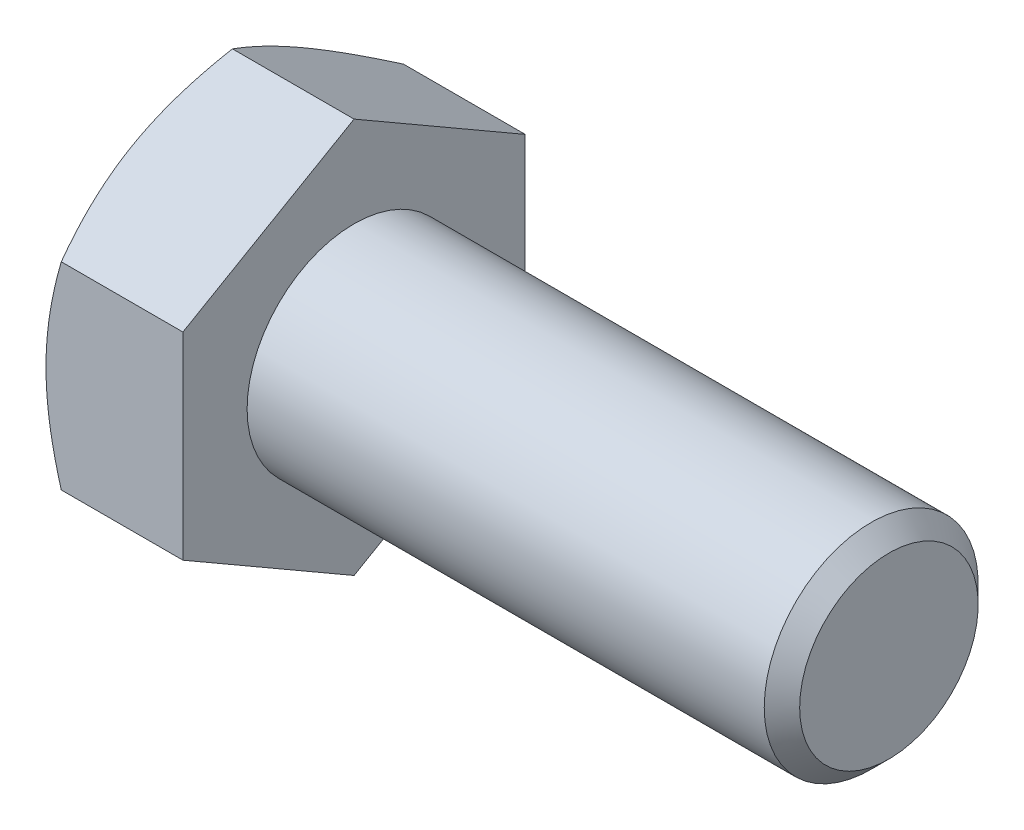
ISO-10303-21;
HEADER;
FILE_DESCRIPTION(('STEP AP214'),'2;1');
FILE_NAME('part.step','',(''),(''),'','','');
FILE_SCHEMA(('AUTOMOTIVE_DESIGN { 1 0 10303 214 1 1 1 1 }'));
ENDSEC;
DATA;
#1=APPLICATION_CONTEXT('core data for automotive mechanical design processes');
#2=APPLICATION_PROTOCOL_DEFINITION('international standard','automotive_design',2000,#1);
#3=PRODUCT_CONTEXT('',#1,'mechanical');
#4=PRODUCT('Part','Part','',(#3));
#5=PRODUCT_RELATED_PRODUCT_CATEGORY('part','',(#4));
#6=PRODUCT_DEFINITION_FORMATION('','',#4);
#7=PRODUCT_DEFINITION_CONTEXT('part definition',#1,'design');
#8=PRODUCT_DEFINITION('design','',#6,#7);
#9=PRODUCT_DEFINITION_SHAPE('','',#8);
#10=(LENGTH_UNIT() NAMED_UNIT(*) SI_UNIT(.MILLI.,.METRE.));
#11=(NAMED_UNIT(*) PLANE_ANGLE_UNIT() SI_UNIT($,.RADIAN.));
#12=(NAMED_UNIT(*) SI_UNIT($,.STERADIAN.) SOLID_ANGLE_UNIT());
#13=UNCERTAINTY_MEASURE_WITH_UNIT(LENGTH_MEASURE(1.E-05),#10,'distance_accuracy_value','');
#14=(GEOMETRIC_REPRESENTATION_CONTEXT(3) GLOBAL_UNCERTAINTY_ASSIGNED_CONTEXT((#13)) GLOBAL_UNIT_ASSIGNED_CONTEXT((#10,
#11,#12)) REPRESENTATION_CONTEXT('',''));
#15=CARTESIAN_POINT('',(0.,0.,0.));
#16=DIRECTION('',(0.,0.,1.));
#17=DIRECTION('',(1.,0.,0.));
#18=AXIS2_PLACEMENT_3D('',#15,#16,#17);
#19=CARTESIAN_POINT('',(6.4,4.618802153517,-8.));
#20=DIRECTION('',(0.,-0.866025403784438,0.500000000000001));
#21=DIRECTION('',(0.,-0.500000000000001,-0.866025403784438));
#22=AXIS2_PLACEMENT_3D('',#19,#20,#21);
#23=PLANE('',#22);
#24=CARTESIAN_POINT('',(0.714597847732979,9.23771977708786,0.0002));
#25=CARTESIAN_POINT('',(0.655990714047303,9.13619343437813,-0.175648783879896));
#26=CARTESIAN_POINT('',(0.600043401047296,9.03428856550538,-0.352153194306134));
#27=CARTESIAN_POINT('',(0.494201005024671,8.82965122633297,-0.706595462878459));
#28=CARTESIAN_POINT('',(0.444308534431071,8.72691841905233,-0.884533904692712));
#29=CARTESIAN_POINT('',(0.304692797206869,8.41707512197076,-1.42119823762264));
#30=CARTESIAN_POINT('',(0.225281170978371,8.20874154247285,-1.78204258223572));
#31=CARTESIAN_POINT('',(0.13216164629449,7.89697436704785,-2.32203917020405));
#32=CARTESIAN_POINT('',(0.105634581029126,7.79447216638295,-2.49957818964328));
#33=CARTESIAN_POINT('',(0.0611531748588764,7.58900421950647,-2.8554591129602));
#34=CARTESIAN_POINT('',(0.0431980765145801,7.4860385150631,-3.03380094449324));
#35=CARTESIAN_POINT('',(0.0163156484918647,7.27992981503517,-3.39079168482359));
#36=CARTESIAN_POINT('',(0.00737807354623315,7.17678715432034,-3.5694400136095));
#37=CARTESIAN_POINT('',(-0.00127769603487041,6.97040655051484,-3.92690170509738));
#38=CARTESIAN_POINT('',(-0.000996175497151026,6.86716861046638,-4.10571506253007));
#39=CARTESIAN_POINT('',(0.00814502526877449,6.67416139438126,-4.44001336701691));
#40=CARTESIAN_POINT('',(0.0158896043673687,6.58437849849726,-4.59552190433867));
#41=CARTESIAN_POINT('',(0.0382011348534268,6.40502298765178,-4.90617476174051));
#42=CARTESIAN_POINT('',(0.0527685461381453,6.31545038727451,-5.06131905656));
#43=CARTESIAN_POINT('',(0.106360690527533,6.04707935721953,-5.52615131589482));
#44=CARTESIAN_POINT('',(0.155268641669141,5.86875596743374,-5.83501648718172));
#45=CARTESIAN_POINT('',(0.277539403234311,5.51021755801477,-6.4560232287603));
#46=CARTESIAN_POINT('',(0.351420520375995,5.3300482973958,-6.76808554211448));
#47=CARTESIAN_POINT('',(0.519100141254967,4.97239658367397,-7.38755648169476));
#48=CARTESIAN_POINT('',(0.61285926085445,4.79490955046824,-7.69497304089175));
#49=CARTESIAN_POINT('',(0.714597847732972,4.61868668346316,-8.0002));
#50=B_SPLINE_CURVE_WITH_KNOTS('',3,(#24,#25,#26,#27,#28,#29,#30,#31,#32,#33,#34,#35,#36,#37,#38,
#39,#40,#41,#42,#43,#44,#45,#46,#47,#48,#49),.UNSPECIFIED.,.F.,.F.,(4,2,2,2,2,2,2,2,2,2,2,2,4),
(0.,0.633973543721351,1.26821965714356,2.53934712434766,3.15934343977049,3.77928496069784,
4.39852133866766,5.01773858515596,5.55680239410249,6.09590254421148,7.17487077411835,
8.27776850154293,9.37850115249055),.UNSPECIFIED.);
#51=CARTESIAN_POINT('',(0.714531179816327,9.23760430703402,0.));
#52=VERTEX_POINT('',#51);
#53=CARTESIAN_POINT('',(0.,6.9282032302755,-4.00000000000001));
#54=VERTEX_POINT('',#53);
#55=EDGE_CURVE('E51',#52,#54,#50,.T.);
#56=ORIENTED_EDGE('',*,*,#55,.F.);
#57=DIRECTION('',(-1.,0.,0.));
#58=VECTOR('',#57,1.);
#59=CARTESIAN_POINT('',(6.4,9.23760430703402,0.));
#60=LINE('',#59,#58);
#61=CARTESIAN_POINT('',(6.4,9.23760430703402,0.));
#62=VERTEX_POINT('',#61);
#63=EDGE_CURVE('E147',#62,#52,#60,.T.);
#64=ORIENTED_EDGE('',*,*,#63,.F.);
#65=DIRECTION('',(0.,0.500000000000001,0.866025403784438));
#66=VECTOR('',#65,1.);
#67=CARTESIAN_POINT('',(6.4,4.618802153517,-8.));
#68=LINE('',#67,#66);
#69=CARTESIAN_POINT('',(6.4,4.618802153517,-8.));
#70=VERTEX_POINT('',#69);
#71=EDGE_CURVE('E238',#70,#62,#68,.T.);
#72=ORIENTED_EDGE('',*,*,#71,.F.);
#73=DIRECTION('',(-1.,0.,0.));
#74=VECTOR('',#73,1.);
#75=CARTESIAN_POINT('',(6.4,4.618802153517,-8.));
#76=LINE('',#75,#74);
#77=CARTESIAN_POINT('',(0.71453117981632,4.618802153517,-8.));
#78=VERTEX_POINT('',#77);
#79=EDGE_CURVE('E135',#70,#78,#76,.T.);
#80=ORIENTED_EDGE('',*,*,#79,.T.);
#81=EDGE_CURVE('E129',#54,#78,#50,.T.);
#82=ORIENTED_EDGE('',*,*,#81,.F.);
#83=EDGE_LOOP('',(#56,#64,#72,#80,#82));
#84=FACE_BOUND('',#83,.T.);
#85=ADVANCED_FACE('F35',(#84),#23,.F.);
#86=CARTESIAN_POINT('',(6.4,9.23760430703402,0.));
#87=DIRECTION('',(0.,-0.866025403784438,-0.500000000000001));
#88=DIRECTION('',(0.,0.500000000000001,-0.866025403784438));
#89=AXIS2_PLACEMENT_3D('',#86,#87,#88);
#90=PLANE('',#89);
#91=CARTESIAN_POINT('',(0.714597847732973,4.61868668346316,8.0002));
#92=CARTESIAN_POINT('',(0.655990714047298,4.72021302617289,7.8243512161201));
#93=CARTESIAN_POINT('',(0.60004340104729,4.82211789504563,7.64784680569387));
#94=CARTESIAN_POINT('',(0.494201005024666,5.02675523421805,7.29340453712154));
#95=CARTESIAN_POINT('',(0.444308534431066,5.12948804149869,7.11546609530729));
#96=CARTESIAN_POINT('',(0.304692797206865,5.43933133858026,6.57880176237736));
#97=CARTESIAN_POINT('',(0.225281170978368,5.64766491807817,6.21795741776428));
#98=CARTESIAN_POINT('',(0.132161646294488,5.95943209350317,5.67796082979595));
#99=CARTESIAN_POINT('',(0.105634581029123,6.06193429416807,5.50042181035672));
#100=CARTESIAN_POINT('',(0.0611531748588752,6.26740224104454,5.1445408870398));
#101=CARTESIAN_POINT('',(0.0431980765145799,6.37036794548792,4.96619905550676));
#102=CARTESIAN_POINT('',(0.0163156484918649,6.57647664551585,4.60920831517641));
#103=CARTESIAN_POINT('',(0.00737807354623263,6.67961930623067,4.4305599863905));
#104=CARTESIAN_POINT('',(-0.00127769603487089,6.88599991003618,4.07309829490262));
#105=CARTESIAN_POINT('',(-0.000996175497150731,6.98923785008464,3.89428493746994));
#106=CARTESIAN_POINT('',(0.00814502526877543,7.18224506616975,3.5599866329831));
#107=CARTESIAN_POINT('',(0.0158896043673697,7.27202796205376,3.40447809566133));
#108=CARTESIAN_POINT('',(0.0382011348534283,7.45138347289924,3.09382523825949));
#109=CARTESIAN_POINT('',(0.0527685461381474,7.54095607327651,2.93868094344));
#110=CARTESIAN_POINT('',(0.106360690527536,7.80932710333149,2.47384868410519));
#111=CARTESIAN_POINT('',(0.155268641669144,7.98765049311728,2.16498351281828));
#112=CARTESIAN_POINT('',(0.277539403234314,8.34618890253625,1.5439767712397));
#113=CARTESIAN_POINT('',(0.351420520376,8.52635816315522,1.23191445788552));
#114=CARTESIAN_POINT('',(0.519100141254974,8.88400987687705,0.612443518305242));
#115=CARTESIAN_POINT('',(0.612859260854458,9.06149691008278,0.30502695910825));
#116=CARTESIAN_POINT('',(0.714597847732978,9.23771977708786,-0.000200000000000107));
#117=B_SPLINE_CURVE_WITH_KNOTS('',3,(#91,#92,#93,#94,#95,#96,#97,#98,#99,#100,#101,#102,#103,
#104,#105,#106,#107,#108,#109,#110,#111,#112,#113,#114,#115,#116),.UNSPECIFIED.,.F.,.F.,(4,2,2,
2,2,2,2,2,2,2,2,2,4),(0.,0.63397354372135,1.26821965714356,2.53934712434766,3.15934343977049,
3.77928496069784,4.39852133866766,5.01773858515595,5.55680239410249,6.09590254421148,
7.17487077411835,8.27776850154293,9.37850115249055),.UNSPECIFIED.);
#118=CARTESIAN_POINT('',(0.714531179816321,4.618802153517,8.));
#119=VERTEX_POINT('',#118);
#120=CARTESIAN_POINT('',(0.,6.9282032302755,4.00000000000001));
#121=VERTEX_POINT('',#120);
#122=EDGE_CURVE('E58',#119,#121,#117,.T.);
#123=ORIENTED_EDGE('',*,*,#122,.F.);
#124=DIRECTION('',(-1.,0.,0.));
#125=VECTOR('',#124,1.);
#126=CARTESIAN_POINT('',(6.4,4.618802153517,8.));
#127=LINE('',#126,#125);
#128=CARTESIAN_POINT('',(6.4,4.618802153517,8.));
#129=VERTEX_POINT('',#128);
#130=EDGE_CURVE('E145',#129,#119,#127,.T.);
#131=ORIENTED_EDGE('',*,*,#130,.F.);
#132=DIRECTION('',(0.,-0.500000000000001,0.866025403784438));
#133=VECTOR('',#132,1.);
#134=CARTESIAN_POINT('',(6.4,9.23760430703402,0.));
#135=LINE('',#134,#133);
#136=EDGE_CURVE('E236',#62,#129,#135,.T.);
#137=ORIENTED_EDGE('',*,*,#136,.F.);
#138=ORIENTED_EDGE('',*,*,#63,.T.);
#139=EDGE_CURVE('E162',#121,#52,#117,.T.);
#140=ORIENTED_EDGE('',*,*,#139,.F.);
#141=EDGE_LOOP('',(#123,#131,#137,#138,#140));
#142=FACE_BOUND('',#141,.T.);
#143=ADVANCED_FACE('F168',(#142),#90,.F.);
#144=CARTESIAN_POINT('',(6.4,4.618802153517,8.));
#145=DIRECTION('',(0.,0.,-1.));
#146=DIRECTION('',(0.,1.,0.));
#147=AXIS2_PLACEMENT_3D('',#144,#145,#146);
#148=PLANE('',#147);
#149=CARTESIAN_POINT('',(4.0249059095589,-12.6546855843617,8.));
#150=CARTESIAN_POINT('',(3.85338487375992,-12.3031246800229,8.));
#151=CARTESIAN_POINT('',(3.68343819387201,-11.9507829192251,8.));
#152=CARTESIAN_POINT('',(3.34757427772116,-11.2441233293434,8.));
#153=CARTESIAN_POINT('',(3.18165763115451,-10.8898052202859,8.));
#154=CARTESIAN_POINT('',(2.85395194343767,-10.1770689379398,8.));
#155=CARTESIAN_POINT('',(2.69218824963991,-9.81863907172209,8.));
#156=CARTESIAN_POINT('',(2.37495726740339,-9.09901412811098,8.));
#157=CARTESIAN_POINT('',(2.21948969724235,-8.7378191753042,8.));
#158=CARTESIAN_POINT('',(1.91124909611307,-7.99950051377994,8.));
#159=CARTESIAN_POINT('',(1.75875676572667,-7.6222589905811,8.));
#160=CARTESIAN_POINT('',(1.4647241129891,-6.86345576673941,8.));
#161=CARTESIAN_POINT('',(1.32318498461757,-6.48189360029687,8.));
#162=CARTESIAN_POINT('',(1.05459432501408,-5.71447512364443,8.));
#163=CARTESIAN_POINT('',(0.927515476081562,-5.32862847439953,8.));
#164=CARTESIAN_POINT('',(0.691757211097743,-4.55141880373956,8.));
#165=CARTESIAN_POINT('',(0.583072254842116,-4.16005748194272,8.));
#166=CARTESIAN_POINT('',(0.389750376844221,-3.37376378274518,8.));
#167=CARTESIAN_POINT('',(0.304973724086277,-2.97886668674348,8.));
#168=CARTESIAN_POINT('',(0.199275200237229,-2.38273452840881,8.));
#169=CARTESIAN_POINT('',(0.16761875570946,-2.18337977711938,8.));
#170=CARTESIAN_POINT('',(0.112075358694773,-1.78359737601684,8.));
#171=CARTESIAN_POINT('',(0.0881876500546175,-1.58316983255303,8.));
#172=CARTESIAN_POINT('',(0.0489706977401173,-1.18423542027824,8.));
#173=CARTESIAN_POINT('',(0.0335291730980846,-0.985739637458753,8.));
#174=CARTESIAN_POINT('',(0.0110629716488628,-0.588272086946668,8.));
#175=CARTESIAN_POINT('',(0.00403814825767006,-0.389300327604079,8.));
#176=CARTESIAN_POINT('',(-0.00142584062082072,0.00876221081485041,8.));
#177=CARTESIAN_POINT('',(0.000134957676475766,0.207852989385609,8.));
#178=CARTESIAN_POINT('',(0.0118014217876197,0.605786203078692,8.));
#179=CARTESIAN_POINT('',(0.021907467381071,0.804628626769928,8.));
#180=CARTESIAN_POINT('',(0.0557165373437156,1.27520491378394,8.));
#181=CARTESIAN_POINT('',(0.0830672695242088,1.54668291471765,8.));
#182=CARTESIAN_POINT('',(0.152259238389072,2.08777092307493,8.));
#183=CARTESIAN_POINT('',(0.194102243863657,2.35738069838157,8.));
#184=CARTESIAN_POINT('',(0.339163188799742,3.1630177466564,8.));
#185=CARTESIAN_POINT('',(0.461891294668976,3.69558688173418,8.));
#186=CARTESIAN_POINT('',(0.676586595213059,4.49226053267631,8.));
#187=CARTESIAN_POINT('',(0.754301850106128,4.76044512009594,8.));
#188=CARTESIAN_POINT('',(0.918275616254534,5.29421544036087,8.));
#189=CARTESIAN_POINT('',(1.00453419017724,5.55980115412707,8.));
#190=CARTESIAN_POINT('',(1.18417203245489,6.0884483689393,8.));
#191=CARTESIAN_POINT('',(1.27754931556252,6.35151055086866,8.));
#192=CARTESIAN_POINT('',(1.47027924561323,6.87542420819582,8.));
#193=CARTESIAN_POINT('',(1.56963178297477,7.1362757240355,8.));
#194=CARTESIAN_POINT('',(1.83061788216801,7.80218874880575,8.));
#195=CARTESIAN_POINT('',(1.99585030591404,8.20583800152902,8.));
#196=CARTESIAN_POINT('',(2.33560643435574,9.00922090340246,8.));
#197=CARTESIAN_POINT('',(2.5101309931742,9.40895418858892,8.));
#198=CARTESIAN_POINT('',(2.86641484762338,10.2053302393418,8.));
#199=CARTESIAN_POINT('',(3.04817649203489,10.6019719507727,8.));
#200=CARTESIAN_POINT('',(3.41731474780413,11.3926098653434,8.));
#201=CARTESIAN_POINT('',(3.60469117417197,11.7866061551194,8.));
#202=CARTESIAN_POINT('',(3.98417976786821,12.5730081264133,8.));
#203=CARTESIAN_POINT('',(4.17629837893025,12.9654106921397,8.));
#204=CARTESIAN_POINT('',(4.56413460673707,13.7484335593548,8.));
#205=CARTESIAN_POINT('',(4.75985224746019,14.1390538489476,8.));
#206=CARTESIAN_POINT('',(5.15417790496087,14.9187386930099,8.));
#207=CARTESIAN_POINT('',(5.3527853705295,15.3078035265797,8.));
#208=CARTESIAN_POINT('',(5.75241277357115,16.0846929446672,8.));
#209=CARTESIAN_POINT('',(5.95343272118931,16.4725175239607,8.));
#210=CARTESIAN_POINT('',(6.52023157707932,17.5591699504467,8.));
#211=CARTESIAN_POINT('',(6.88826669162659,18.2568207923884,8.));
#212=CARTESIAN_POINT('',(7.62911645716787,19.6496204420456,8.));
#213=CARTESIAN_POINT('',(8.00193135552977,20.3447691178627,8.));
#214=CARTESIAN_POINT('',(8.74998840178781,21.7309493426279,8.));
#215=CARTESIAN_POINT('',(9.12521929790289,22.4219869677796,8.));
#216=CARTESIAN_POINT('',(9.69012625678304,23.4573861735835,8.));
#217=CARTESIAN_POINT('',(9.87876537279047,23.8023143161837,8.));
#218=CARTESIAN_POINT('',(10.2566598278908,24.4918321964471,8.));
#219=CARTESIAN_POINT('',(10.4459151660088,24.8364219346447,8.));
#220=CARTESIAN_POINT('',(10.635441440782,25.1808626322182,8.));
#221=B_SPLINE_CURVE_WITH_KNOTS('',3,(#149,#150,#151,#152,#153,#154,#155,#156,#157,#158,#159,
#160,#161,#162,#163,#164,#165,#166,#167,#168,#169,#170,#171,#172,#173,#174,#175,#176,#177,#178,
#179,#180,#181,#182,#183,#184,#185,#186,#187,#188,#189,#190,#191,#192,#193,#194,#195,#196,#197,
#198,#199,#200,#201,#202,#203,#204,#205,#206,#207,#208,#209,#210,#211,#212,#213,#214,#215,#216,
#217,#218,#219,#220),.UNSPECIFIED.,.F.,.F.,(4,2,2,2,2,2,2,2,2,2,2,2,2,2,2,2,2,2,2,2,2,2,2,2,2,2,
2,2,2,2,2,2,2,2,2,4),(0.,1.17352534285519,2.34722138025917,3.52689945010166,4.70652467637677,
5.92708317141315,7.14777452944079,8.36612012171132,9.58409809506408,10.7948027119676,
11.4002329189197,12.0056041799731,12.6027191107726,13.199823642157,13.7969256548693,
14.3940542062034,15.2121538291978,16.030353336924,17.6675489652002,18.5051258655031,
19.3427089100958,20.1800592201861,21.0173941785985,22.3257038346385,23.6341339573728,
24.9429922461244,26.2518074593073,27.5625113626671,28.8732240016858,30.1836898283921,
31.4941611678941,33.8604585893124,36.2268789719356,38.5858914350282,39.7653150976311,
40.9447368953005),.UNSPECIFIED.);
#222=CARTESIAN_POINT('',(0.714531179816316,-4.61880215351698,8.));
#223=VERTEX_POINT('',#222);
#224=CARTESIAN_POINT('',(0.,0.,8.));
#225=VERTEX_POINT('',#224);
#226=EDGE_CURVE('E248',#223,#225,#221,.T.);
#227=ORIENTED_EDGE('',*,*,#226,.F.);
#228=DIRECTION('',(-1.,0.,0.));
#229=VECTOR('',#228,1.);
#230=CARTESIAN_POINT('',(6.4,-4.61880215351698,8.));
#231=LINE('',#230,#229);
#232=CARTESIAN_POINT('',(6.4,-4.61880215351698,8.));
#233=VERTEX_POINT('',#232);
#234=EDGE_CURVE('E137',#233,#223,#231,.T.);
#235=ORIENTED_EDGE('',*,*,#234,.F.);
#236=DIRECTION('',(0.,-1.,0.));
#237=VECTOR('',#236,1.);
#238=CARTESIAN_POINT('',(6.4,4.618802153517,8.));
#239=LINE('',#238,#237);
#240=EDGE_CURVE('E232',#129,#233,#239,.T.);
#241=ORIENTED_EDGE('',*,*,#240,.F.);
#242=ORIENTED_EDGE('',*,*,#130,.T.);
#243=EDGE_CURVE('E186',#225,#119,#221,.T.);
#244=ORIENTED_EDGE('',*,*,#243,.F.);
#245=EDGE_LOOP('',(#227,#235,#241,#242,#244));
#246=FACE_BOUND('',#245,.T.);
#247=ADVANCED_FACE('F254',(#246),#148,.F.);
#248=CARTESIAN_POINT('',(6.4,-9.23760430703401,0.));
#249=DIRECTION('',(0.,0.866025403784437,-0.500000000000002));
#250=DIRECTION('',(0.,0.500000000000002,0.866025403784438));
#251=AXIS2_PLACEMENT_3D('',#248,#249,#250);
#252=PLANE('',#251);
#253=CARTESIAN_POINT('',(0.714597847732975,-9.23771977708785,-0.000200000000000038));
#254=CARTESIAN_POINT('',(0.655990714047299,-9.13619343437813,0.175648783879895));
#255=CARTESIAN_POINT('',(0.60004340104729,-9.03428856550538,0.352153194306134));
#256=CARTESIAN_POINT('',(0.494201005024666,-8.82965122633296,0.706595462878459));
#257=CARTESIAN_POINT('',(0.444308534431066,-8.72691841905232,0.884533904692711));
#258=CARTESIAN_POINT('',(0.304692797206864,-8.41707512197076,1.42119823762264));
#259=CARTESIAN_POINT('',(0.225281170978367,-8.20874154247284,1.78204258223572));
#260=CARTESIAN_POINT('',(0.132161646294485,-7.89697436704784,2.32203917020405));
#261=CARTESIAN_POINT('',(0.10563458102912,-7.79447216638294,2.49957818964328));
#262=CARTESIAN_POINT('',(0.0611531748588715,-7.58900421950646,2.8554591129602));
#263=CARTESIAN_POINT('',(0.043198076514576,-7.48603851506309,3.03380094449324));
#264=CARTESIAN_POINT('',(0.0163156484918609,-7.27992981503516,3.39079168482359));
#265=CARTESIAN_POINT('',(0.00737807354622867,-7.17678715432034,3.5694400136095));
#266=CARTESIAN_POINT('',(-0.00127769603487594,-6.97040655051483,3.92690170509738));
#267=CARTESIAN_POINT('',(-0.000996175497156998,-6.86716861046637,4.10571506253006));
#268=CARTESIAN_POINT('',(0.00814502526876799,-6.67416139438126,4.4400133670169));
#269=CARTESIAN_POINT('',(0.0158896043673621,-6.58437849849725,4.59552190433867));
#270=CARTESIAN_POINT('',(0.0382011348534206,-6.40502298765177,4.90617476174051));
#271=CARTESIAN_POINT('',(0.0527685461381397,-6.3154503872745,5.06131905655999));
#272=CARTESIAN_POINT('',(0.106360690527528,-6.04707935721952,5.52615131589481));
#273=CARTESIAN_POINT('',(0.155268641669135,-5.86875596743373,5.83501648718172));
#274=CARTESIAN_POINT('',(0.277539403234304,-5.51021755801476,6.4560232287603));
#275=CARTESIAN_POINT('',(0.351420520375989,-5.33004829739579,6.76808554211447));
#276=CARTESIAN_POINT('',(0.519100141254961,-4.97239658367396,7.38755648169476));
#277=CARTESIAN_POINT('',(0.612859260854445,-4.79490955046823,7.69497304089175));
#278=CARTESIAN_POINT('',(0.714597847732967,-4.61868668346315,8.0002));
#279=B_SPLINE_CURVE_WITH_KNOTS('',3,(#253,#254,#255,#256,#257,#258,#259,#260,#261,#262,#263,
#264,#265,#266,#267,#268,#269,#270,#271,#272,#273,#274,#275,#276,#277,#278),.UNSPECIFIED.,.F.,
.F.,(4,2,2,2,2,2,2,2,2,2,2,2,4),(0.,0.633973543721351,1.26821965714356,2.53934712434766,
3.15934343977049,3.77928496069784,4.39852133866766,5.01773858515595,5.55680239410249,
6.09590254421148,7.17487077411835,8.27776850154293,9.37850115249056),.UNSPECIFIED.);
#280=CARTESIAN_POINT('',(0.714531179816323,-9.23760430703401,0.));
#281=VERTEX_POINT('',#280);
#282=CARTESIAN_POINT('',(0.,-6.9282032302755,4.00000000000002));
#283=VERTEX_POINT('',#282);
#284=EDGE_CURVE('E170',#281,#283,#279,.T.);
#285=ORIENTED_EDGE('',*,*,#284,.F.);
#286=DIRECTION('',(-1.,0.,0.));
#287=VECTOR('',#286,1.);
#288=CARTESIAN_POINT('',(6.4,-9.23760430703401,0.));
#289=LINE('',#288,#287);
#290=CARTESIAN_POINT('',(6.4,-9.23760430703401,0.));
#291=VERTEX_POINT('',#290);
#292=EDGE_CURVE('E134',#291,#281,#289,.T.);
#293=ORIENTED_EDGE('',*,*,#292,.F.);
#294=DIRECTION('',(0.,-0.500000000000002,-0.866025403784438));
#295=VECTOR('',#294,1.);
#296=CARTESIAN_POINT('',(6.4,-9.23760430703401,0.));
#297=LINE('',#296,#295);
#298=EDGE_CURVE('E230',#233,#291,#297,.T.);
#299=ORIENTED_EDGE('',*,*,#298,.F.);
#300=ORIENTED_EDGE('',*,*,#234,.T.);
#301=EDGE_CURVE('E172',#283,#223,#279,.T.);
#302=ORIENTED_EDGE('',*,*,#301,.F.);
#303=EDGE_LOOP('',(#285,#293,#299,#300,#302));
#304=FACE_BOUND('',#303,.T.);
#305=ADVANCED_FACE('F226',(#304),#252,.F.);
#306=CARTESIAN_POINT('',(6.4,-4.61880215351701,-8.));
#307=DIRECTION('',(0.,0.866025403784439,0.5));
#308=DIRECTION('',(0.,-0.5,0.866025403784439));
#309=AXIS2_PLACEMENT_3D('',#306,#307,#308);
#310=PLANE('',#309);
#311=CARTESIAN_POINT('',(0.714597847732976,-4.61868668346317,-8.0002));
#312=CARTESIAN_POINT('',(0.655990714047301,-4.7202130261729,-7.8243512161201));
#313=CARTESIAN_POINT('',(0.600043401047293,-4.82211789504565,-7.64784680569387));
#314=CARTESIAN_POINT('',(0.494201005024669,-5.02675523421806,-7.29340453712154));
#315=CARTESIAN_POINT('',(0.444308534431069,-5.1294880414987,-7.11546609530729));
#316=CARTESIAN_POINT('',(0.304692797206868,-5.43933133858027,-6.57880176237736));
#317=CARTESIAN_POINT('',(0.225281170978371,-5.64766491807818,-6.21795741776427));
#318=CARTESIAN_POINT('',(0.13216164629449,-5.95943209350317,-5.67796082979595));
#319=CARTESIAN_POINT('',(0.105634581029126,-6.06193429416808,-5.50042181035671));
#320=CARTESIAN_POINT('',(0.0611531748588766,-6.26740224104455,-5.1445408870398));
#321=CARTESIAN_POINT('',(0.0431980765145806,-6.37036794548792,-4.96619905550676));
#322=CARTESIAN_POINT('',(0.0163156484918658,-6.57647664551586,-4.6092083151764));
#323=CARTESIAN_POINT('',(0.00737807354623422,-6.67961930623068,-4.4305599863905));
#324=CARTESIAN_POINT('',(-0.00127769603486898,-6.88599991003619,-4.07309829490261));
#325=CARTESIAN_POINT('',(-0.000996175497149287,-6.98923785008464,-3.89428493746993));
#326=CARTESIAN_POINT('',(0.00814502526877674,-7.18224506616976,-3.55998663298309));
#327=CARTESIAN_POINT('',(0.0158896043673712,-7.27202796205376,-3.40447809566132));
#328=CARTESIAN_POINT('',(0.0382011348534295,-7.45138347289924,-3.09382523825949));
#329=CARTESIAN_POINT('',(0.052768546138148,-7.54095607327651,-2.93868094344));
#330=CARTESIAN_POINT('',(0.106360690527535,-7.80932710333149,-2.47384868410518));
#331=CARTESIAN_POINT('',(0.155268641669143,-7.98765049311728,-2.16498351281828));
#332=CARTESIAN_POINT('',(0.277539403234313,-8.34618890253624,-1.5439767712397));
#333=CARTESIAN_POINT('',(0.351420520375999,-8.52635816315522,-1.23191445788552));
#334=CARTESIAN_POINT('',(0.519100141254971,-8.88400987687704,-0.612443518305241));
#335=CARTESIAN_POINT('',(0.612859260854454,-9.06149691008277,-0.30502695910825));
#336=CARTESIAN_POINT('',(0.714597847732974,-9.23771977708785,0.000200000000000447));
#337=B_SPLINE_CURVE_WITH_KNOTS('',3,(#311,#312,#313,#314,#315,#316,#317,#318,#319,#320,#321,
#322,#323,#324,#325,#326,#327,#328,#329,#330,#331,#332,#333,#334,#335,#336),.UNSPECIFIED.,.F.,
.F.,(4,2,2,2,2,2,2,2,2,2,2,2,4),(0.,0.633973543721351,1.26821965714356,2.53934712434766,
3.15934343977049,3.77928496069784,4.39852133866766,5.01773858515595,5.55680239410249,
6.09590254421148,7.17487077411835,8.27776850154292,9.37850115249054),.UNSPECIFIED.);
#338=CARTESIAN_POINT('',(0.71453117981616,-4.61880215351726,-8.));
#339=VERTEX_POINT('',#338);
#340=CARTESIAN_POINT('',(0.,-6.92820323027551,-4.));
#341=VERTEX_POINT('',#340);
#342=EDGE_CURVE('E111',#339,#341,#337,.T.);
#343=ORIENTED_EDGE('',*,*,#342,.F.);
#344=DIRECTION('',(-1.,0.,0.));
#345=VECTOR('',#344,1.);
#346=CARTESIAN_POINT('',(6.4,-4.61880215351701,-8.));
#347=LINE('',#346,#345);
#348=CARTESIAN_POINT('',(6.4,-4.61880215351701,-8.));
#349=VERTEX_POINT('',#348);
#350=EDGE_CURVE('E125',#349,#339,#347,.T.);
#351=ORIENTED_EDGE('',*,*,#350,.F.);
#352=DIRECTION('',(0.,0.5,-0.866025403784439));
#353=VECTOR('',#352,1.);
#354=CARTESIAN_POINT('',(6.4,-4.61880215351701,-8.));
#355=LINE('',#354,#353);
#356=EDGE_CURVE('E228',#291,#349,#355,.T.);
#357=ORIENTED_EDGE('',*,*,#356,.F.);
#358=ORIENTED_EDGE('',*,*,#292,.T.);
#359=EDGE_CURVE('E128',#341,#281,#337,.T.);
#360=ORIENTED_EDGE('',*,*,#359,.F.);
#361=EDGE_LOOP('',(#343,#351,#357,#358,#360));
#362=FACE_BOUND('',#361,.T.);
#363=ADVANCED_FACE('F123',(#362),#310,.F.);
#364=CARTESIAN_POINT('',(6.4,4.618802153517,-8.));
#365=DIRECTION('',(0.,0.,1.));
#366=DIRECTION('',(1.,0.,0.));
#367=AXIS2_PLACEMENT_3D('',#364,#365,#366);
#368=PLANE('',#367);
#369=CARTESIAN_POINT('',(4.02490590955892,-12.6546855843617,-8.));
#370=CARTESIAN_POINT('',(3.85338487375994,-12.3031246800229,-8.));
#371=CARTESIAN_POINT('',(3.68343819387203,-11.9507829192251,-8.));
#372=CARTESIAN_POINT('',(3.34757427772117,-11.2441233293434,-8.));
#373=CARTESIAN_POINT('',(3.18165763115452,-10.889805220286,-8.));
#374=CARTESIAN_POINT('',(2.85395194343769,-10.1770689379399,-8.));
#375=CARTESIAN_POINT('',(2.69218824963993,-9.81863907172212,-8.));
#376=CARTESIAN_POINT('',(2.37495726740341,-9.09901412811101,-8.));
#377=CARTESIAN_POINT('',(2.21948969724236,-8.73781917530424,-8.));
#378=CARTESIAN_POINT('',(1.91124909611308,-7.99950051377997,-8.));
#379=CARTESIAN_POINT('',(1.75875676572668,-7.62225899058113,-8.));
#380=CARTESIAN_POINT('',(1.46472411298911,-6.86345576673944,-8.));
#381=CARTESIAN_POINT('',(1.32318498461758,-6.4818936002969,-8.));
#382=CARTESIAN_POINT('',(1.05459432501409,-5.71447512364446,-8.));
#383=CARTESIAN_POINT('',(0.927515476081571,-5.32862847439956,-8.));
#384=CARTESIAN_POINT('',(0.691757211097752,-4.55141880373959,-8.));
#385=CARTESIAN_POINT('',(0.583072254842124,-4.16005748194275,-8.));
#386=CARTESIAN_POINT('',(0.389750376844226,-3.37376378274521,-8.));
#387=CARTESIAN_POINT('',(0.304973724086282,-2.9788666867435,-8.));
#388=CARTESIAN_POINT('',(0.199275200237234,-2.38273452840883,-8.));
#389=CARTESIAN_POINT('',(0.167618755709465,-2.1833797771194,-8.));
#390=CARTESIAN_POINT('',(0.112075358694778,-1.78359737601686,-8.));
#391=CARTESIAN_POINT('',(0.0881876500546208,-1.58316983255305,-8.));
#392=CARTESIAN_POINT('',(0.0489706977401193,-1.18423542027826,-8.));
#393=CARTESIAN_POINT('',(0.0335291730980864,-0.985739637458773,-8.));
#394=CARTESIAN_POINT('',(0.0110629716488642,-0.588272086946688,-8.));
#395=CARTESIAN_POINT('',(0.00403814825767108,-0.389300327604099,-8.));
#396=CARTESIAN_POINT('',(-0.0014258406208207,0.00876221081483027,-8.));
#397=CARTESIAN_POINT('',(0.000134957676475132,0.207852989385589,-8.));
#398=CARTESIAN_POINT('',(0.0118014217876193,0.605786203078673,-8.));
#399=CARTESIAN_POINT('',(0.0219074673810715,0.804628626769909,-8.));
#400=CARTESIAN_POINT('',(0.0557165373437159,1.27520491378392,-8.));
#401=CARTESIAN_POINT('',(0.0830672695242071,1.54668291471763,-8.));
#402=CARTESIAN_POINT('',(0.152259238389069,2.08777092307492,-8.));
#403=CARTESIAN_POINT('',(0.194102243863653,2.35738069838155,-8.));
#404=CARTESIAN_POINT('',(0.339163188799738,3.16301774665637,-8.));
#405=CARTESIAN_POINT('',(0.461891294668971,3.69558688173416,-8.));
#406=CARTESIAN_POINT('',(0.676586595213053,4.49226053267629,-8.));
#407=CARTESIAN_POINT('',(0.754301850106122,4.76044512009592,-8.));
#408=CARTESIAN_POINT('',(0.918275616254527,5.29421544036084,-8.));
#409=CARTESIAN_POINT('',(1.00453419017723,5.55980115412704,-8.));
#410=CARTESIAN_POINT('',(1.18417203245488,6.08844836893928,-8.));
#411=CARTESIAN_POINT('',(1.27754931556251,6.35151055086863,-8.));
#412=CARTESIAN_POINT('',(1.47027924561321,6.87542420819579,-8.));
#413=CARTESIAN_POINT('',(1.56963178297475,7.13627572403547,-8.));
#414=CARTESIAN_POINT('',(1.830617882168,7.80218874880572,-8.));
#415=CARTESIAN_POINT('',(1.99585030591402,8.20583800152899,-8.));
#416=CARTESIAN_POINT('',(2.33560643435573,9.00922090340243,-8.));
#417=CARTESIAN_POINT('',(2.51013099317419,9.40895418858889,-8.));
#418=CARTESIAN_POINT('',(2.86641484762337,10.2053302393418,-8.));
#419=CARTESIAN_POINT('',(3.04817649203488,10.6019719507727,-8.));
#420=CARTESIAN_POINT('',(3.41731474780412,11.3926098653434,-8.));
#421=CARTESIAN_POINT('',(3.60469117417196,11.7866061551194,-8.));
#422=CARTESIAN_POINT('',(3.9841797678682,12.5730081264133,-8.));
#423=CARTESIAN_POINT('',(4.17629837893024,12.9654106921397,-8.));
#424=CARTESIAN_POINT('',(4.56413460673706,13.7484335593548,-8.));
#425=CARTESIAN_POINT('',(4.75985224746018,14.1390538489476,-8.));
#426=CARTESIAN_POINT('',(5.15417790496086,14.9187386930099,-8.));
#427=CARTESIAN_POINT('',(5.35278537052949,15.3078035265797,-8.));
#428=CARTESIAN_POINT('',(5.75241277357115,16.0846929446672,-8.));
#429=CARTESIAN_POINT('',(5.95343272118931,16.4725175239607,-8.));
#430=CARTESIAN_POINT('',(6.52023157707932,17.5591699504467,-8.));
#431=CARTESIAN_POINT('',(6.88826669162659,18.2568207923884,-8.));
#432=CARTESIAN_POINT('',(7.62911645716787,19.6496204420456,-8.));
#433=CARTESIAN_POINT('',(8.00193135552977,20.3447691178627,-8.));
#434=CARTESIAN_POINT('',(8.74998840178782,21.7309493426279,-8.));
#435=CARTESIAN_POINT('',(9.1252192979029,22.4219869677796,-8.));
#436=CARTESIAN_POINT('',(9.69012625678305,23.4573861735835,-8.));
#437=CARTESIAN_POINT('',(9.87876537279048,23.8023143161837,-8.));
#438=CARTESIAN_POINT('',(10.2566598278908,24.4918321964471,-8.));
#439=CARTESIAN_POINT('',(10.4459151660088,24.8364219346447,-8.));
#440=CARTESIAN_POINT('',(10.635441440782,25.1808626322182,-8.));
#441=B_SPLINE_CURVE_WITH_KNOTS('',3,(#369,#370,#371,#372,#373,#374,#375,#376,#377,#378,#379,
#380,#381,#382,#383,#384,#385,#386,#387,#388,#389,#390,#391,#392,#393,#394,#395,#396,#397,#398,
#399,#400,#401,#402,#403,#404,#405,#406,#407,#408,#409,#410,#411,#412,#413,#414,#415,#416,#417,
#418,#419,#420,#421,#422,#423,#424,#425,#426,#427,#428,#429,#430,#431,#432,#433,#434,#435,#436,
#437,#438,#439,#440),.UNSPECIFIED.,.F.,.F.,(4,2,2,2,2,2,2,2,2,2,2,2,2,2,2,2,2,2,2,2,2,2,2,2,2,2,
2,2,2,2,2,2,2,2,2,4),(0.,1.1735253428552,2.34722138025918,3.52689945010167,4.70652467637677,
5.92708317141316,7.1477745294408,8.36612012171134,9.58409809506409,10.7948027119676,
11.4002329189197,12.0056041799731,12.6027191107726,13.1998236421571,13.7969256548694,
14.3940542062034,15.2121538291978,16.0303533369241,17.6675489652002,18.5051258655031,
19.3427089100958,20.1800592201861,21.0173941785985,22.3257038346385,23.6341339573728,
24.9429922461244,26.2518074593073,27.5625113626671,28.8732240016859,30.1836898283921,
31.4941611678941,33.8604585893124,36.2268789719357,38.5858914350282,39.7653150976312,
40.9447368953005),.UNSPECIFIED.);
#442=CARTESIAN_POINT('',(0.,0.,-8.));
#443=VERTEX_POINT('',#442);
#444=EDGE_CURVE('E117',#78,#443,#441,.F.);
#445=ORIENTED_EDGE('',*,*,#444,.F.);
#446=ORIENTED_EDGE('',*,*,#79,.F.);
#447=DIRECTION('',(0.,1.,0.));
#448=VECTOR('',#447,1.);
#449=CARTESIAN_POINT('',(6.4,4.618802153517,-8.));
#450=LINE('',#449,#448);
#451=EDGE_CURVE('E133',#349,#70,#450,.T.);
#452=ORIENTED_EDGE('',*,*,#451,.F.);
#453=ORIENTED_EDGE('',*,*,#350,.T.);
#454=EDGE_CURVE('E108',#443,#339,#441,.F.);
#455=ORIENTED_EDGE('',*,*,#454,.F.);
#456=EDGE_LOOP('',(#445,#446,#452,#453,#455));
#457=FACE_BOUND('',#456,.T.);
#458=ADVANCED_FACE('F131',(#457),#368,.F.);
#459=CARTESIAN_POINT('',(6.4,9.23760430703402,0.));
#460=DIRECTION('',(1.,0.,0.));
#461=DIRECTION('',(0.,0.,-1.));
#462=AXIS2_PLACEMENT_3D('',#459,#460,#461);
#463=PLANE('',#462);
#464=CARTESIAN_POINT('',(6.4,0.,0.));
#465=DIRECTION('',(1.,0.,0.));
#466=DIRECTION('',(0.,0.,-1.));
#467=AXIS2_PLACEMENT_3D('',#464,#465,#466);
#468=CIRCLE('',#467,5.);
#469=CARTESIAN_POINT('',(6.4,0.,-5.));
#470=VERTEX_POINT('',#469);
#471=EDGE_CURVE('E241',#470,#470,#468,.F.);
#472=ORIENTED_EDGE('',*,*,#471,.T.);
#473=EDGE_LOOP('',(#472));
#474=FACE_BOUND('',#473,.T.);
#475=ORIENTED_EDGE('',*,*,#71,.T.);
#476=ORIENTED_EDGE('',*,*,#136,.T.);
#477=ORIENTED_EDGE('',*,*,#240,.T.);
#478=ORIENTED_EDGE('',*,*,#298,.T.);
#479=ORIENTED_EDGE('',*,*,#356,.T.);
#480=ORIENTED_EDGE('',*,*,#451,.T.);
#481=EDGE_LOOP('',(#475,#476,#477,#478,#479,#480));
#482=FACE_BOUND('',#481,.T.);
#483=ADVANCED_FACE('F256',(#474,#482),#463,.T.);
#484=CARTESIAN_POINT('',(0.,0.,0.));
#485=DIRECTION('',(-1.,0.,0.));
#486=DIRECTION('',(0.,0.,1.));
#487=AXIS2_PLACEMENT_3D('',#484,#485,#486);
#488=CYLINDRICAL_SURFACE('',#487,5.);
#489=ORIENTED_EDGE('',*,*,#471,.F.);
#490=EDGE_LOOP('',(#489));
#491=FACE_BOUND('',#490,.T.);
#492=CARTESIAN_POINT('',(30.572,0.,0.));
#493=DIRECTION('',(-1.,0.,0.));
#494=DIRECTION('',(0.,0.,1.));
#495=AXIS2_PLACEMENT_3D('',#492,#493,#494);
#496=CIRCLE('',#495,5.);
#497=CARTESIAN_POINT('',(30.572,0.,5.));
#498=VERTEX_POINT('',#497);
#499=EDGE_CURVE('E244',#498,#498,#496,.T.);
#500=ORIENTED_EDGE('',*,*,#499,.T.);
#501=EDGE_LOOP('',(#500));
#502=FACE_BOUND('',#501,.T.);
#503=ADVANCED_FACE('F287',(#491,#502),#488,.T.);
#504=CARTESIAN_POINT('',(31.4,0.,0.));
#505=DIRECTION('',(-1.,0.,0.));
#506=DIRECTION('',(0.,0.,1.));
#507=AXIS2_PLACEMENT_3D('',#504,#505,#506);
#508=CONICAL_SURFACE('',#507,4.172,0.785398163397443);
#509=ORIENTED_EDGE('',*,*,#499,.F.);
#510=EDGE_LOOP('',(#509));
#511=FACE_BOUND('',#510,.T.);
#512=CARTESIAN_POINT('',(31.4,0.,0.));
#513=DIRECTION('',(-1.,0.,0.));
#514=DIRECTION('',(0.,0.,1.));
#515=AXIS2_PLACEMENT_3D('',#512,#513,#514);
#516=CIRCLE('',#515,4.172);
#517=CARTESIAN_POINT('',(31.4,0.,4.172));
#518=VERTEX_POINT('',#517);
#519=EDGE_CURVE('E246',#518,#518,#516,.T.);
#520=ORIENTED_EDGE('',*,*,#519,.T.);
#521=EDGE_LOOP('',(#520));
#522=FACE_BOUND('',#521,.T.);
#523=ADVANCED_FACE('F290',(#511,#522),#508,.T.);
#524=CARTESIAN_POINT('',(31.4,0.,0.));
#525=DIRECTION('',(-1.,0.,0.));
#526=DIRECTION('',(0.,0.,1.));
#527=AXIS2_PLACEMENT_3D('',#524,#525,#526);
#528=PLANE('',#527);
#529=ORIENTED_EDGE('',*,*,#519,.F.);
#530=EDGE_LOOP('',(#529));
#531=FACE_BOUND('',#530,.T.);
#532=ADVANCED_FACE('F200',(#531),#528,.F.);
#533=CARTESIAN_POINT('',(0.,0.,0.));
#534=DIRECTION('',(1.,0.,0.));
#535=DIRECTION('',(0.,0.,-1.));
#536=AXIS2_PLACEMENT_3D('',#533,#534,#535);
#537=CONICAL_SURFACE('',#536,8.,1.0471975511966);
#538=ORIENTED_EDGE('',*,*,#342,.T.);
#539=CARTESIAN_POINT('',(0.,0.,0.));
#540=DIRECTION('',(1.,0.,0.));
#541=DIRECTION('',(0.,0.,-1.));
#542=AXIS2_PLACEMENT_3D('',#539,#540,#541);
#543=CIRCLE('',#542,8.);
#544=EDGE_CURVE('E39',#341,#443,#543,.T.);
#545=ORIENTED_EDGE('',*,*,#544,.T.);
#546=ORIENTED_EDGE('',*,*,#454,.T.);
#547=EDGE_LOOP('',(#538,#545,#546));
#548=FACE_BOUND('',#547,.T.);
#549=ADVANCED_FACE('F110',(#548),#537,.T.);
#550=ORIENTED_EDGE('',*,*,#284,.T.);
#551=EDGE_CURVE('E152',#283,#341,#543,.T.);
#552=ORIENTED_EDGE('',*,*,#551,.T.);
#553=ORIENTED_EDGE('',*,*,#359,.T.);
#554=EDGE_LOOP('',(#550,#552,#553));
#555=FACE_BOUND('',#554,.T.);
#556=ADVANCED_FACE('F199',(#555),#537,.T.);
#557=ORIENTED_EDGE('',*,*,#226,.T.);
#558=EDGE_CURVE('E153',#225,#283,#543,.T.);
#559=ORIENTED_EDGE('',*,*,#558,.T.);
#560=ORIENTED_EDGE('',*,*,#301,.T.);
#561=EDGE_LOOP('',(#557,#559,#560));
#562=FACE_BOUND('',#561,.T.);
#563=ADVANCED_FACE('F194',(#562),#537,.T.);
#564=ORIENTED_EDGE('',*,*,#243,.T.);
#565=ORIENTED_EDGE('',*,*,#122,.T.);
#566=CARTESIAN_POINT('',(0.,0.,0.));
#567=DIRECTION('',(-1.,0.,0.));
#568=DIRECTION('',(0.,0.,1.));
#569=AXIS2_PLACEMENT_3D('',#566,#567,#568);
#570=CIRCLE('',#569,8.);
#571=EDGE_CURVE('E118',#225,#121,#570,.T.);
#572=ORIENTED_EDGE('',*,*,#571,.F.);
#573=EDGE_LOOP('',(#564,#565,#572));
#574=FACE_BOUND('',#573,.T.);
#575=ADVANCED_FACE('F198',(#574),#537,.T.);
#576=ORIENTED_EDGE('',*,*,#139,.T.);
#577=ORIENTED_EDGE('',*,*,#55,.T.);
#578=EDGE_CURVE('E44',#54,#121,#543,.T.);
#579=ORIENTED_EDGE('',*,*,#578,.T.);
#580=EDGE_LOOP('',(#576,#577,#579));
#581=FACE_BOUND('',#580,.T.);
#582=ADVANCED_FACE('F161',(#581),#537,.T.);
#583=ORIENTED_EDGE('',*,*,#81,.T.);
#584=ORIENTED_EDGE('',*,*,#444,.T.);
#585=EDGE_CURVE('E11',#443,#54,#543,.T.);
#586=ORIENTED_EDGE('',*,*,#585,.T.);
#587=EDGE_LOOP('',(#583,#584,#586));
#588=FACE_BOUND('',#587,.T.);
#589=ADVANCED_FACE('F259',(#588),#537,.T.);
#590=CARTESIAN_POINT('',(0.,9.23760430703402,0.));
#591=DIRECTION('',(1.,0.,0.));
#592=DIRECTION('',(0.,0.,-1.));
#593=AXIS2_PLACEMENT_3D('',#590,#591,#592);
#594=PLANE('',#593);
#595=ORIENTED_EDGE('',*,*,#585,.F.);
#596=ORIENTED_EDGE('',*,*,#544,.F.);
#597=ORIENTED_EDGE('',*,*,#551,.F.);
#598=ORIENTED_EDGE('',*,*,#558,.F.);
#599=ORIENTED_EDGE('',*,*,#571,.T.);
#600=ORIENTED_EDGE('',*,*,#578,.F.);
#601=EDGE_LOOP('',(#595,#596,#597,#598,#599,#600));
#602=FACE_BOUND('',#601,.T.);
#603=ADVANCED_FACE('F165',(#602),#594,.F.);
#604=CLOSED_SHELL('',(#85,#143,#247,#305,#363,#458,#483,#503,#523,#532,#549,#556,#563,#575,#582,
#589,#603));
#605=MANIFOLD_SOLID_BREP('B2',#604);
#606=ADVANCED_BREP_SHAPE_REPRESENTATION('',(#18,#605),#14);
#607=SHAPE_DEFINITION_REPRESENTATION(#9,#606);
ENDSEC;
END-ISO-10303-21;
